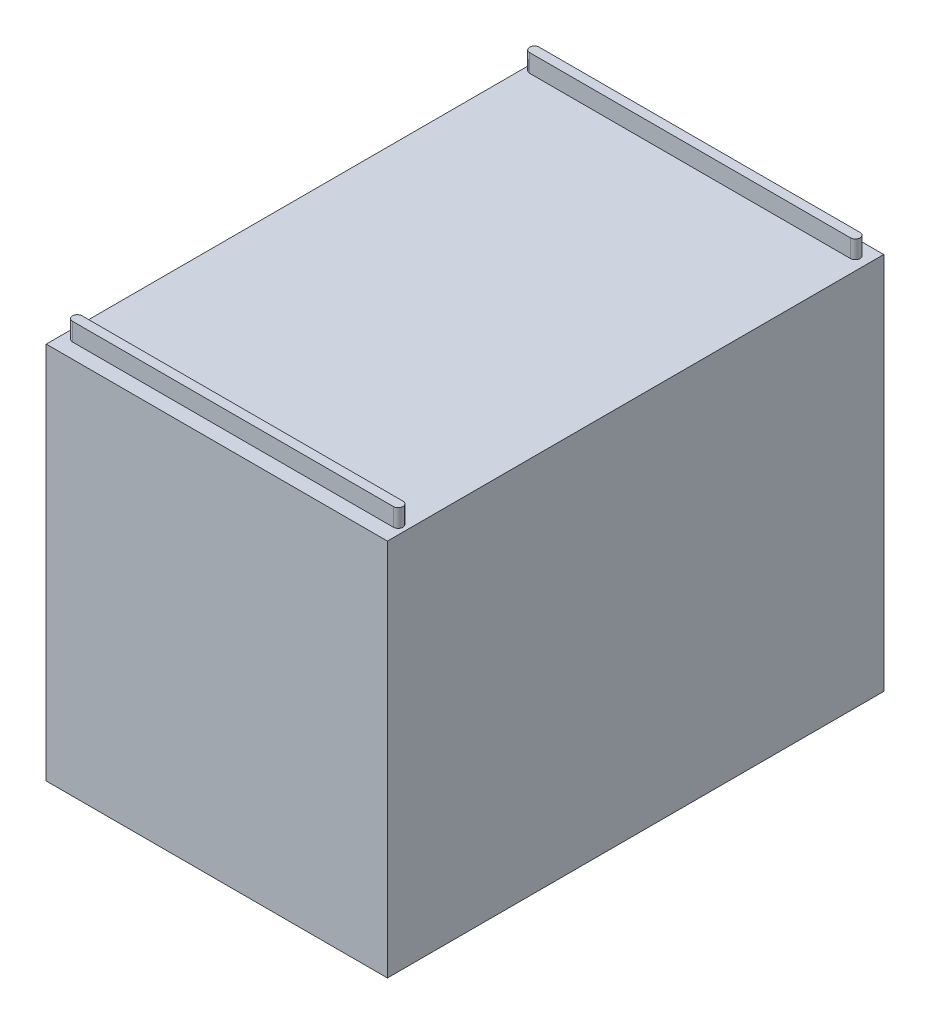
ISO-10303-21;
HEADER;
FILE_DESCRIPTION(('STEP AP214'),'2;1');
FILE_NAME('part.step','',(''),(''),'','','');
FILE_SCHEMA(('AUTOMOTIVE_DESIGN { 1 0 10303 214 1 1 1 1 }'));
ENDSEC;
DATA;
#1=APPLICATION_CONTEXT('core data for automotive mechanical design processes');
#2=APPLICATION_PROTOCOL_DEFINITION('international standard','automotive_design',2000,#1);
#3=PRODUCT_CONTEXT('',#1,'mechanical');
#4=PRODUCT('Part','Part','',(#3));
#5=PRODUCT_RELATED_PRODUCT_CATEGORY('part','',(#4));
#6=PRODUCT_DEFINITION_FORMATION('','',#4);
#7=PRODUCT_DEFINITION_CONTEXT('part definition',#1,'design');
#8=PRODUCT_DEFINITION('design','',#6,#7);
#9=PRODUCT_DEFINITION_SHAPE('','',#8);
#10=(LENGTH_UNIT() NAMED_UNIT(*) SI_UNIT(.MILLI.,.METRE.));
#11=(NAMED_UNIT(*) PLANE_ANGLE_UNIT() SI_UNIT($,.RADIAN.));
#12=(NAMED_UNIT(*) SI_UNIT($,.STERADIAN.) SOLID_ANGLE_UNIT());
#13=UNCERTAINTY_MEASURE_WITH_UNIT(LENGTH_MEASURE(1.E-05),#10,'distance_accuracy_value','');
#14=(GEOMETRIC_REPRESENTATION_CONTEXT(3) GLOBAL_UNCERTAINTY_ASSIGNED_CONTEXT((#13)) GLOBAL_UNIT_ASSIGNED_CONTEXT((#10,
#11,#12)) REPRESENTATION_CONTEXT('',''));
#15=CARTESIAN_POINT('',(0.,0.,0.));
#16=DIRECTION('',(0.,0.,1.));
#17=DIRECTION('',(1.,0.,0.));
#18=AXIS2_PLACEMENT_3D('',#15,#16,#17);
#19=CARTESIAN_POINT('',(2.,51.4955968520772,109.113300223872));
#20=DIRECTION('',(0.,-1.,0.));
#21=DIRECTION('',(0.,0.,-1.));
#22=AXIS2_PLACEMENT_3D('',#19,#20,#21);
#23=PLANE('',#22);
#24=DIRECTION('',(-1.,0.,0.));
#25=VECTOR('',#24,1.);
#26=CARTESIAN_POINT('',(1.88791249608245,51.4955968520772,105.030139818183));
#27=LINE('',#26,#25);
#28=CARTESIAN_POINT('',(55.5032426503019,51.4955968520772,105.030139818183));
#29=VERTEX_POINT('',#28);
#30=CARTESIAN_POINT('',(1.88791249608245,51.4955968520772,105.030139818183));
#31=VERTEX_POINT('',#30);
#32=EDGE_CURVE('E727',#29,#31,#27,.T.);
#33=ORIENTED_EDGE('',*,*,#32,.F.);
#34=CARTESIAN_POINT('',(55.5032426503019,51.4955968520772,105.822875190851));
#35=DIRECTION('',(0.,1.,0.));
#36=DIRECTION('',(0.,0.,1.));
#37=AXIS2_PLACEMENT_3D('',#34,#35,#36);
#38=CIRCLE('',#37,0.792735372668218);
#39=CARTESIAN_POINT('',(55.5032426503019,51.4955968520772,106.615610563519));
#40=VERTEX_POINT('',#39);
#41=EDGE_CURVE('E736',#40,#29,#38,.T.);
#42=ORIENTED_EDGE('',*,*,#41,.F.);
#43=DIRECTION('',(1.,0.,0.));
#44=VECTOR('',#43,1.);
#45=CARTESIAN_POINT('',(1.88791249608245,51.4955968520772,106.615610563519));
#46=LINE('',#45,#44);
#47=CARTESIAN_POINT('',(1.88791249608245,51.4955968520772,106.615610563519));
#48=VERTEX_POINT('',#47);
#49=EDGE_CURVE('E716',#48,#40,#46,.T.);
#50=ORIENTED_EDGE('',*,*,#49,.F.);
#51=CARTESIAN_POINT('',(1.88791249608245,51.4955968520772,105.822875190851));
#52=DIRECTION('',(0.,1.,0.));
#53=DIRECTION('',(0.,0.,1.));
#54=AXIS2_PLACEMENT_3D('',#51,#52,#53);
#55=CIRCLE('',#54,0.792735372668218);
#56=EDGE_CURVE('E712',#31,#48,#55,.T.);
#57=ORIENTED_EDGE('',*,*,#56,.F.);
#58=EDGE_LOOP('',(#33,#42,#50,#57));
#59=FACE_BOUND('',#58,.T.);
#60=DIRECTION('',(0.,0.,1.));
#61=VECTOR('',#60,1.);
#62=CARTESIAN_POINT('',(0.,51.4955968520772,109.113300223872));
#63=LINE('',#62,#61);
#64=CARTESIAN_POINT('',(0.,51.4955968520772,26.1853162216021));
#65=VERTEX_POINT('',#64);
#66=CARTESIAN_POINT('',(0.,51.4955968520772,109.113300223872));
#67=VERTEX_POINT('',#66);
#68=EDGE_CURVE('E270',#65,#67,#63,.T.);
#69=ORIENTED_EDGE('',*,*,#68,.T.);
#70=DIRECTION('',(-1.,0.,0.));
#71=VECTOR('',#70,1.);
#72=CARTESIAN_POINT('',(2.,51.4955968520772,109.113300223872));
#73=LINE('',#72,#71);
#74=CARTESIAN_POINT('',(57.,51.4955968520772,109.113300223872));
#75=VERTEX_POINT('',#74);
#76=EDGE_CURVE('E273',#75,#67,#73,.T.);
#77=ORIENTED_EDGE('',*,*,#76,.F.);
#78=DIRECTION('',(0.,0.,1.));
#79=VECTOR('',#78,1.);
#80=CARTESIAN_POINT('',(57.,51.4955968520772,109.113300223872));
#81=LINE('',#80,#79);
#82=CARTESIAN_POINT('',(57.,51.4955968520772,26.1853162216021));
#83=VERTEX_POINT('',#82);
#84=EDGE_CURVE('E256',#83,#75,#81,.T.);
#85=ORIENTED_EDGE('',*,*,#84,.F.);
#86=DIRECTION('',(-1.,0.,0.));
#87=VECTOR('',#86,1.);
#88=CARTESIAN_POINT('',(2.,51.4955968520772,26.1853162216021));
#89=LINE('',#88,#87);
#90=EDGE_CURVE('E275',#83,#65,#89,.T.);
#91=ORIENTED_EDGE('',*,*,#90,.T.);
#92=EDGE_LOOP('',(#69,#77,#85,#91));
#93=FACE_BOUND('',#92,.T.);
#94=CARTESIAN_POINT('',(1.20636212602488,51.4955968520772,28.7593672566491));
#95=DIRECTION('',(0.,1.,0.));
#96=DIRECTION('',(0.,0.,1.));
#97=AXIS2_PLACEMENT_3D('',#94,#95,#96);
#98=CIRCLE('',#97,0.792735372668218);
#99=CARTESIAN_POINT('',(1.20636212602488,51.4955968520772,27.9666318839809));
#100=VERTEX_POINT('',#99);
#101=CARTESIAN_POINT('',(1.20636212602488,51.4955968520772,29.5521026293173));
#102=VERTEX_POINT('',#101);
#103=EDGE_CURVE('E711',#100,#102,#98,.T.);
#104=ORIENTED_EDGE('',*,*,#103,.F.);
#105=DIRECTION('',(-1.,0.,0.));
#106=VECTOR('',#105,1.);
#107=CARTESIAN_POINT('',(1.20636212602488,51.4955968520772,27.9666318839809));
#108=LINE('',#107,#106);
#109=CARTESIAN_POINT('',(54.8216922802444,51.4955968520772,27.9666318839809));
#110=VERTEX_POINT('',#109);
#111=EDGE_CURVE('E707',#110,#100,#108,.T.);
#112=ORIENTED_EDGE('',*,*,#111,.F.);
#113=CARTESIAN_POINT('',(54.8216922802444,51.4955968520772,28.7593672566491));
#114=DIRECTION('',(0.,1.,0.));
#115=DIRECTION('',(0.,0.,1.));
#116=AXIS2_PLACEMENT_3D('',#113,#114,#115);
#117=CIRCLE('',#116,0.792735372668218);
#118=CARTESIAN_POINT('',(54.8216922802444,51.4955968520772,29.5521026293173));
#119=VERTEX_POINT('',#118);
#120=EDGE_CURVE('E858',#119,#110,#117,.T.);
#121=ORIENTED_EDGE('',*,*,#120,.F.);
#122=DIRECTION('',(1.,0.,0.));
#123=VECTOR('',#122,1.);
#124=CARTESIAN_POINT('',(1.20636212602488,51.4955968520772,29.5521026293173));
#125=LINE('',#124,#123);
#126=EDGE_CURVE('E56',#102,#119,#125,.T.);
#127=ORIENTED_EDGE('',*,*,#126,.F.);
#128=EDGE_LOOP('',(#104,#112,#121,#127));
#129=FACE_BOUND('',#128,.T.);
#130=ADVANCED_FACE('F34',(#59,#93,#129),#23,.F.);
#131=CARTESIAN_POINT('',(2.,0.,0.));
#132=DIRECTION('',(1.,0.,0.));
#133=DIRECTION('',(0.,0.,-1.));
#134=AXIS2_PLACEMENT_3D('',#131,#132,#133);
#135=PLANE('',#134);
#136=DIRECTION('',(0.,-1.,0.));
#137=VECTOR('',#136,1.);
#138=CARTESIAN_POINT('',(2.,0.,98.15899887559));
#139=LINE('',#138,#137);
#140=CARTESIAN_POINT('',(2.,30.0428200792169,98.15899887559));
#141=VERTEX_POINT('',#140);
#142=CARTESIAN_POINT('',(2.,-0.559273207727524,98.15899887559));
#143=VERTEX_POINT('',#142);
#144=EDGE_CURVE('E840',#141,#143,#139,.T.);
#145=ORIENTED_EDGE('',*,*,#144,.F.);
#146=DIRECTION('',(0.,0.,1.));
#147=VECTOR('',#146,1.);
#148=CARTESIAN_POINT('',(2.,30.0428200792169,0.));
#149=LINE('',#148,#147);
#150=CARTESIAN_POINT('',(2.,30.0428200792169,56.6585640793278));
#151=VERTEX_POINT('',#150);
#152=EDGE_CURVE('E827',#151,#141,#149,.T.);
#153=ORIENTED_EDGE('',*,*,#152,.F.);
#154=DIRECTION('',(0.,1.,0.));
#155=VECTOR('',#154,1.);
#156=CARTESIAN_POINT('',(2.,0.,56.6585640793278));
#157=LINE('',#156,#155);
#158=CARTESIAN_POINT('',(2.,-0.559273207727524,56.6585640793278));
#159=VERTEX_POINT('',#158);
#160=EDGE_CURVE('E835',#159,#151,#157,.T.);
#161=ORIENTED_EDGE('',*,*,#160,.F.);
#162=DIRECTION('',(0.,0.,-1.));
#163=VECTOR('',#162,1.);
#164=CARTESIAN_POINT('',(2.,-0.559273207727524,0.));
#165=LINE('',#164,#163);
#166=EDGE_CURVE('E838',#143,#159,#165,.T.);
#167=ORIENTED_EDGE('',*,*,#166,.F.);
#168=EDGE_LOOP('',(#145,#153,#161,#167));
#169=FACE_BOUND('',#168,.T.);
#170=DIRECTION('',(0.,0.,1.));
#171=VECTOR('',#170,1.);
#172=CARTESIAN_POINT('',(2.,-7.75802853354126,109.113300223872));
#173=LINE('',#172,#171);
#174=CARTESIAN_POINT('',(2.,-7.75802853354126,30.1211238131174));
#175=VERTEX_POINT('',#174);
#176=CARTESIAN_POINT('',(2.,-7.75802853354126,104.891427523128));
#177=VERTEX_POINT('',#176);
#178=EDGE_CURVE('E245',#175,#177,#173,.T.);
#179=ORIENTED_EDGE('',*,*,#178,.F.);
#180=DIRECTION('',(0.,1.,0.));
#181=VECTOR('',#180,1.);
#182=CARTESIAN_POINT('',(2.,-10.9702115813971,30.1211238131174));
#183=LINE('',#182,#181);
#184=CARTESIAN_POINT('',(2.,48.0297884186029,30.1211238131174));
#185=VERTEX_POINT('',#184);
#186=EDGE_CURVE('E233',#175,#185,#183,.T.);
#187=ORIENTED_EDGE('',*,*,#186,.T.);
#188=DIRECTION('',(0.,0.,-1.));
#189=VECTOR('',#188,1.);
#190=CARTESIAN_POINT('',(2.,48.0297884186029,109.113300223872));
#191=LINE('',#190,#189);
#192=CARTESIAN_POINT('',(2.,48.0297884186029,104.891427523128));
#193=VERTEX_POINT('',#192);
#194=EDGE_CURVE('E249',#193,#185,#191,.T.);
#195=ORIENTED_EDGE('',*,*,#194,.F.);
#196=DIRECTION('',(0.,1.,0.));
#197=VECTOR('',#196,1.);
#198=CARTESIAN_POINT('',(2.,48.0297884186029,104.891427523128));
#199=LINE('',#198,#197);
#200=EDGE_CURVE('E234',#177,#193,#199,.T.);
#201=ORIENTED_EDGE('',*,*,#200,.F.);
#202=EDGE_LOOP('',(#179,#187,#195,#201));
#203=FACE_BOUND('',#202,.T.);
#204=DIRECTION('',(0.,0.,1.));
#205=VECTOR('',#204,1.);
#206=CARTESIAN_POINT('',(2.,14.1758803163095,36.8475382860855));
#207=LINE('',#206,#205);
#208=CARTESIAN_POINT('',(2.,14.1758803163095,36.8475382860855));
#209=VERTEX_POINT('',#208);
#210=CARTESIAN_POINT('',(2.,14.1758803163095,47.313522717548));
#211=VERTEX_POINT('',#210);
#212=EDGE_CURVE('E765',#209,#211,#207,.T.);
#213=ORIENTED_EDGE('',*,*,#212,.F.);
#214=DIRECTION('',(0.,1.,0.));
#215=VECTOR('',#214,1.);
#216=CARTESIAN_POINT('',(2.,0.,36.8475382860855));
#217=LINE('',#216,#215);
#218=CARTESIAN_POINT('',(2.,0.,36.8475382860855));
#219=VERTEX_POINT('',#218);
#220=EDGE_CURVE('E751',#219,#209,#217,.T.);
#221=ORIENTED_EDGE('',*,*,#220,.F.);
#222=DIRECTION('',(0.,0.,-1.));
#223=VECTOR('',#222,1.);
#224=CARTESIAN_POINT('',(2.,0.,36.8475382860855));
#225=LINE('',#224,#223);
#226=CARTESIAN_POINT('',(2.,0.,47.313522717548));
#227=VERTEX_POINT('',#226);
#228=EDGE_CURVE('E756',#227,#219,#225,.T.);
#229=ORIENTED_EDGE('',*,*,#228,.F.);
#230=DIRECTION('',(0.,-1.,0.));
#231=VECTOR('',#230,1.);
#232=CARTESIAN_POINT('',(2.,0.,47.313522717548));
#233=LINE('',#232,#231);
#234=EDGE_CURVE('E767',#211,#227,#233,.T.);
#235=ORIENTED_EDGE('',*,*,#234,.F.);
#236=EDGE_LOOP('',(#213,#221,#229,#235));
#237=FACE_BOUND('',#236,.T.);
#238=ADVANCED_FACE('F311',(#169,#203,#237),#135,.T.);
#239=CARTESIAN_POINT('',(57.,48.0297884186029,109.113300223872));
#240=DIRECTION('',(0.,1.,0.));
#241=DIRECTION('',(0.,0.,1.));
#242=AXIS2_PLACEMENT_3D('',#239,#240,#241);
#243=PLANE('',#242);
#244=DIRECTION('',(-1.,0.,0.));
#245=VECTOR('',#244,1.);
#246=CARTESIAN_POINT('',(57.,48.0297884186029,30.1211238131174));
#247=LINE('',#246,#245);
#248=CARTESIAN_POINT('',(56.,48.0297884186029,30.1211238131174));
#249=VERTEX_POINT('',#248);
#250=EDGE_CURVE('E239',#249,#185,#247,.T.);
#251=ORIENTED_EDGE('',*,*,#250,.F.);
#252=DIRECTION('',(0.,0.,1.));
#253=VECTOR('',#252,1.);
#254=CARTESIAN_POINT('',(56.,48.0297884186029,109.113300223872));
#255=LINE('',#254,#253);
#256=CARTESIAN_POINT('',(56.,48.0297884186029,104.891427523128));
#257=VERTEX_POINT('',#256);
#258=EDGE_CURVE('E49',#249,#257,#255,.T.);
#259=ORIENTED_EDGE('',*,*,#258,.T.);
#260=DIRECTION('',(-1.,0.,0.));
#261=VECTOR('',#260,1.);
#262=CARTESIAN_POINT('',(57.,48.0297884186029,104.891427523128));
#263=LINE('',#262,#261);
#264=EDGE_CURVE('E237',#257,#193,#263,.T.);
#265=ORIENTED_EDGE('',*,*,#264,.T.);
#266=ORIENTED_EDGE('',*,*,#194,.T.);
#267=EDGE_LOOP('',(#251,#259,#265,#266));
#268=FACE_BOUND('',#267,.T.);
#269=DIRECTION('',(0.,0.,-1.));
#270=VECTOR('',#269,1.);
#271=CARTESIAN_POINT('',(7.09762250892254,48.0297884186029,36.816501956509));
#272=LINE('',#271,#270);
#273=CARTESIAN_POINT('',(7.09762250892254,48.0297884186029,103.513398298831));
#274=VERTEX_POINT('',#273);
#275=CARTESIAN_POINT('',(7.09762250892254,48.0297884186029,36.816501956509));
#276=VERTEX_POINT('',#275);
#277=EDGE_CURVE('E780',#274,#276,#272,.T.);
#278=ORIENTED_EDGE('',*,*,#277,.F.);
#279=DIRECTION('',(-1.,0.,0.));
#280=VECTOR('',#279,1.);
#281=CARTESIAN_POINT('',(7.09762250892254,48.0297884186029,103.513398298831));
#282=LINE('',#281,#280);
#283=CARTESIAN_POINT('',(51.6742877071579,48.0297884186029,103.513398298831));
#284=VERTEX_POINT('',#283);
#285=EDGE_CURVE('E785',#284,#274,#282,.T.);
#286=ORIENTED_EDGE('',*,*,#285,.F.);
#287=DIRECTION('',(0.,0.,1.));
#288=VECTOR('',#287,1.);
#289=CARTESIAN_POINT('',(51.6742877071579,48.0297884186029,36.816501956509));
#290=LINE('',#289,#288);
#291=CARTESIAN_POINT('',(51.6742877071579,48.0297884186029,36.816501956509));
#292=VERTEX_POINT('',#291);
#293=EDGE_CURVE('E797',#292,#284,#290,.T.);
#294=ORIENTED_EDGE('',*,*,#293,.F.);
#295=DIRECTION('',(1.,0.,0.));
#296=VECTOR('',#295,1.);
#297=CARTESIAN_POINT('',(7.09762250892254,48.0297884186029,36.816501956509));
#298=LINE('',#297,#296);
#299=EDGE_CURVE('E794',#276,#292,#298,.T.);
#300=ORIENTED_EDGE('',*,*,#299,.F.);
#301=EDGE_LOOP('',(#278,#286,#294,#300));
#302=FACE_BOUND('',#301,.T.);
#303=ADVANCED_FACE('F317',(#268,#302),#243,.F.);
#304=CARTESIAN_POINT('',(57.,-7.75802853354126,109.113300223872));
#305=DIRECTION('',(0.,-1.,0.));
#306=DIRECTION('',(0.,0.,-1.));
#307=AXIS2_PLACEMENT_3D('',#304,#305,#306);
#308=PLANE('',#307);
#309=DIRECTION('',(-1.,0.,0.));
#310=VECTOR('',#309,1.);
#311=CARTESIAN_POINT('',(57.,-7.75802853354126,104.891427523128));
#312=LINE('',#311,#310);
#313=CARTESIAN_POINT('',(56.,-7.75802853354126,104.891427523128));
#314=VERTEX_POINT('',#313);
#315=EDGE_CURVE('E229',#314,#177,#312,.T.);
#316=ORIENTED_EDGE('',*,*,#315,.F.);
#317=DIRECTION('',(0.,0.,-1.));
#318=VECTOR('',#317,1.);
#319=CARTESIAN_POINT('',(56.,-7.75802853354126,109.113300223872));
#320=LINE('',#319,#318);
#321=CARTESIAN_POINT('',(56.,-7.75802853354126,30.1211238131174));
#322=VERTEX_POINT('',#321);
#323=EDGE_CURVE('E217',#314,#322,#320,.T.);
#324=ORIENTED_EDGE('',*,*,#323,.T.);
#325=DIRECTION('',(1.,0.,0.));
#326=VECTOR('',#325,1.);
#327=CARTESIAN_POINT('',(57.,-7.75802853354126,30.1211238131174));
#328=LINE('',#327,#326);
#329=EDGE_CURVE('E227',#175,#322,#328,.T.);
#330=ORIENTED_EDGE('',*,*,#329,.F.);
#331=ORIENTED_EDGE('',*,*,#178,.T.);
#332=EDGE_LOOP('',(#316,#324,#330,#331));
#333=FACE_BOUND('',#332,.T.);
#334=ADVANCED_FACE('F225',(#333),#308,.F.);
#335=CARTESIAN_POINT('',(2.,51.4955968520772,109.113300223872));
#336=DIRECTION('',(0.,0.,-1.));
#337=DIRECTION('',(-1.,0.,0.));
#338=AXIS2_PLACEMENT_3D('',#335,#336,#337);
#339=PLANE('',#338);
#340=DIRECTION('',(0.,-1.,0.));
#341=VECTOR('',#340,1.);
#342=CARTESIAN_POINT('',(0.,51.4955968520772,109.113300223872));
#343=LINE('',#342,#341);
#344=CARTESIAN_POINT('',(0.,-11.7253418052314,109.113300223872));
#345=VERTEX_POINT('',#344);
#346=EDGE_CURVE('E259',#67,#345,#343,.T.);
#347=ORIENTED_EDGE('',*,*,#346,.T.);
#348=DIRECTION('',(-1.,0.,0.));
#349=VECTOR('',#348,1.);
#350=CARTESIAN_POINT('',(2.,-11.7253418052314,109.113300223872));
#351=LINE('',#350,#349);
#352=CARTESIAN_POINT('',(57.,-11.7253418052314,109.113300223872));
#353=VERTEX_POINT('',#352);
#354=EDGE_CURVE('E42',#353,#345,#351,.T.);
#355=ORIENTED_EDGE('',*,*,#354,.F.);
#356=DIRECTION('',(0.,-1.,0.));
#357=VECTOR('',#356,1.);
#358=CARTESIAN_POINT('',(57.,51.4955968520772,109.113300223872));
#359=LINE('',#358,#357);
#360=EDGE_CURVE('E251',#75,#353,#359,.T.);
#361=ORIENTED_EDGE('',*,*,#360,.F.);
#362=ORIENTED_EDGE('',*,*,#76,.T.);
#363=EDGE_LOOP('',(#347,#355,#361,#362));
#364=FACE_BOUND('',#363,.T.);
#365=ADVANCED_FACE('F36',(#364),#339,.F.);
#366=CARTESIAN_POINT('',(2.,-11.7253418052314,109.113300223872));
#367=DIRECTION('',(0.,1.,0.));
#368=DIRECTION('',(0.,0.,1.));
#369=AXIS2_PLACEMENT_3D('',#366,#367,#368);
#370=PLANE('',#369);
#371=DIRECTION('',(0.,0.,-1.));
#372=VECTOR('',#371,1.);
#373=CARTESIAN_POINT('',(0.,-11.7253418052314,109.113300223872));
#374=LINE('',#373,#372);
#375=CARTESIAN_POINT('',(0.,-11.7253418052314,26.1853162216021));
#376=VERTEX_POINT('',#375);
#377=EDGE_CURVE('E264',#345,#376,#374,.T.);
#378=ORIENTED_EDGE('',*,*,#377,.T.);
#379=DIRECTION('',(-1.,0.,0.));
#380=VECTOR('',#379,1.);
#381=CARTESIAN_POINT('',(2.,-11.7253418052314,26.1853162216021));
#382=LINE('',#381,#380);
#383=CARTESIAN_POINT('',(57.,-11.7253418052314,26.1853162216021));
#384=VERTEX_POINT('',#383);
#385=EDGE_CURVE('E277',#384,#376,#382,.T.);
#386=ORIENTED_EDGE('',*,*,#385,.F.);
#387=DIRECTION('',(0.,0.,-1.));
#388=VECTOR('',#387,1.);
#389=CARTESIAN_POINT('',(57.,-11.7253418052314,109.113300223872));
#390=LINE('',#389,#388);
#391=EDGE_CURVE('E246',#353,#384,#390,.T.);
#392=ORIENTED_EDGE('',*,*,#391,.F.);
#393=ORIENTED_EDGE('',*,*,#354,.T.);
#394=EDGE_LOOP('',(#378,#386,#392,#393));
#395=FACE_BOUND('',#394,.T.);
#396=ADVANCED_FACE('F282',(#395),#370,.F.);
#397=CARTESIAN_POINT('',(2.,51.4955968520772,26.1853162216021));
#398=DIRECTION('',(0.,0.,1.));
#399=DIRECTION('',(1.,0.,0.));
#400=AXIS2_PLACEMENT_3D('',#397,#398,#399);
#401=PLANE('',#400);
#402=DIRECTION('',(0.,1.,0.));
#403=VECTOR('',#402,1.);
#404=CARTESIAN_POINT('',(0.,51.4955968520772,26.1853162216021));
#405=LINE('',#404,#403);
#406=EDGE_CURVE('E267',#376,#65,#405,.T.);
#407=ORIENTED_EDGE('',*,*,#406,.T.);
#408=ORIENTED_EDGE('',*,*,#90,.F.);
#409=DIRECTION('',(0.,1.,0.));
#410=VECTOR('',#409,1.);
#411=CARTESIAN_POINT('',(57.,51.4955968520772,26.1853162216021));
#412=LINE('',#411,#410);
#413=EDGE_CURVE('E253',#384,#83,#412,.T.);
#414=ORIENTED_EDGE('',*,*,#413,.F.);
#415=ORIENTED_EDGE('',*,*,#385,.T.);
#416=EDGE_LOOP('',(#407,#408,#414,#415));
#417=FACE_BOUND('',#416,.T.);
#418=ADVANCED_FACE('F294',(#417),#401,.F.);
#419=CARTESIAN_POINT('',(0.,0.,0.));
#420=DIRECTION('',(1.,0.,0.));
#421=DIRECTION('',(0.,0.,-1.));
#422=AXIS2_PLACEMENT_3D('',#419,#420,#421);
#423=PLANE('',#422);
#424=DIRECTION('',(0.,0.,-1.));
#425=VECTOR('',#424,1.);
#426=CARTESIAN_POINT('',(0.,30.0428200792169,98.15899887559));
#427=LINE('',#426,#425);
#428=CARTESIAN_POINT('',(0.,30.0428200792169,98.15899887559));
#429=VERTEX_POINT('',#428);
#430=CARTESIAN_POINT('',(0.,30.0428200792169,56.6585640793278));
#431=VERTEX_POINT('',#430);
#432=EDGE_CURVE('E815',#429,#431,#427,.T.);
#433=ORIENTED_EDGE('',*,*,#432,.F.);
#434=DIRECTION('',(0.,1.,0.));
#435=VECTOR('',#434,1.);
#436=CARTESIAN_POINT('',(0.,-0.559273207727524,98.15899887559));
#437=LINE('',#436,#435);
#438=CARTESIAN_POINT('',(0.,-0.559273207727524,98.15899887559));
#439=VERTEX_POINT('',#438);
#440=EDGE_CURVE('E813',#439,#429,#437,.T.);
#441=ORIENTED_EDGE('',*,*,#440,.F.);
#442=DIRECTION('',(0.,0.,1.));
#443=VECTOR('',#442,1.);
#444=CARTESIAN_POINT('',(0.,-0.559273207727524,98.15899887559));
#445=LINE('',#444,#443);
#446=CARTESIAN_POINT('',(0.,-0.559273207727524,56.6585640793278));
#447=VERTEX_POINT('',#446);
#448=EDGE_CURVE('E821',#447,#439,#445,.T.);
#449=ORIENTED_EDGE('',*,*,#448,.F.);
#450=DIRECTION('',(0.,-1.,0.));
#451=VECTOR('',#450,1.);
#452=CARTESIAN_POINT('',(0.,-0.559273207727524,56.6585640793278));
#453=LINE('',#452,#451);
#454=EDGE_CURVE('E818',#431,#447,#453,.T.);
#455=ORIENTED_EDGE('',*,*,#454,.F.);
#456=EDGE_LOOP('',(#433,#441,#449,#455));
#457=FACE_BOUND('',#456,.T.);
#458=ORIENTED_EDGE('',*,*,#346,.F.);
#459=ORIENTED_EDGE('',*,*,#68,.F.);
#460=ORIENTED_EDGE('',*,*,#406,.F.);
#461=ORIENTED_EDGE('',*,*,#377,.F.);
#462=EDGE_LOOP('',(#458,#459,#460,#461));
#463=FACE_BOUND('',#462,.T.);
#464=ADVANCED_FACE('F289',(#457,#463),#423,.F.);
#465=CARTESIAN_POINT('',(57.,0.,0.));
#466=DIRECTION('',(1.,0.,0.));
#467=DIRECTION('',(0.,0.,-1.));
#468=AXIS2_PLACEMENT_3D('',#465,#466,#467);
#469=PLANE('',#468);
#470=ORIENTED_EDGE('',*,*,#391,.T.);
#471=ORIENTED_EDGE('',*,*,#413,.T.);
#472=ORIENTED_EDGE('',*,*,#84,.T.);
#473=ORIENTED_EDGE('',*,*,#360,.T.);
#474=EDGE_LOOP('',(#470,#471,#472,#473));
#475=FACE_BOUND('',#474,.T.);
#476=ADVANCED_FACE('F296',(#475),#469,.T.);
#477=CARTESIAN_POINT('',(57.,48.0297884186029,104.891427523128));
#478=DIRECTION('',(0.,0.,1.));
#479=DIRECTION('',(1.,0.,0.));
#480=AXIS2_PLACEMENT_3D('',#477,#478,#479);
#481=PLANE('',#480);
#482=ORIENTED_EDGE('',*,*,#264,.F.);
#483=DIRECTION('',(0.,-1.,0.));
#484=VECTOR('',#483,1.);
#485=CARTESIAN_POINT('',(56.,48.0297884186029,104.891427523128));
#486=LINE('',#485,#484);
#487=EDGE_CURVE('E847',#257,#314,#486,.T.);
#488=ORIENTED_EDGE('',*,*,#487,.T.);
#489=ORIENTED_EDGE('',*,*,#315,.T.);
#490=ORIENTED_EDGE('',*,*,#200,.T.);
#491=EDGE_LOOP('',(#482,#488,#489,#490));
#492=FACE_BOUND('',#491,.T.);
#493=ADVANCED_FACE('F298',(#492),#481,.F.);
#494=CARTESIAN_POINT('',(57.,-10.9702115813971,30.1211238131174));
#495=DIRECTION('',(0.,0.,-1.));
#496=DIRECTION('',(-1.,0.,0.));
#497=AXIS2_PLACEMENT_3D('',#494,#495,#496);
#498=PLANE('',#497);
#499=ORIENTED_EDGE('',*,*,#329,.T.);
#500=DIRECTION('',(0.,1.,0.));
#501=VECTOR('',#500,1.);
#502=CARTESIAN_POINT('',(56.,-10.9702115813971,30.1211238131174));
#503=LINE('',#502,#501);
#504=EDGE_CURVE('E11',#322,#249,#503,.T.);
#505=ORIENTED_EDGE('',*,*,#504,.T.);
#506=ORIENTED_EDGE('',*,*,#250,.T.);
#507=ORIENTED_EDGE('',*,*,#186,.F.);
#508=EDGE_LOOP('',(#499,#505,#506,#507));
#509=FACE_BOUND('',#508,.T.);
#510=ADVANCED_FACE('F231',(#509),#498,.F.);
#511=CARTESIAN_POINT('',(59.,-0.559273207727524,98.15899887559));
#512=DIRECTION('',(0.,0.,1.));
#513=DIRECTION('',(1.,0.,0.));
#514=AXIS2_PLACEMENT_3D('',#511,#512,#513);
#515=PLANE('',#514);
#516=ORIENTED_EDGE('',*,*,#144,.T.);
#517=DIRECTION('',(-1.,0.,0.));
#518=VECTOR('',#517,1.);
#519=CARTESIAN_POINT('',(59.,-0.559273207727524,98.15899887559));
#520=LINE('',#519,#518);
#521=EDGE_CURVE('E825',#143,#439,#520,.T.);
#522=ORIENTED_EDGE('',*,*,#521,.T.);
#523=ORIENTED_EDGE('',*,*,#440,.T.);
#524=DIRECTION('',(-1.,0.,0.));
#525=VECTOR('',#524,1.);
#526=CARTESIAN_POINT('',(59.,30.0428200792169,98.15899887559));
#527=LINE('',#526,#525);
#528=EDGE_CURVE('E824',#141,#429,#527,.T.);
#529=ORIENTED_EDGE('',*,*,#528,.F.);
#530=EDGE_LOOP('',(#516,#522,#523,#529));
#531=FACE_BOUND('',#530,.T.);
#532=ADVANCED_FACE('F337',(#531),#515,.F.);
#533=CARTESIAN_POINT('',(59.,-0.559273207727524,98.15899887559));
#534=DIRECTION('',(0.,-1.,0.));
#535=DIRECTION('',(0.,0.,-1.));
#536=AXIS2_PLACEMENT_3D('',#533,#534,#535);
#537=PLANE('',#536);
#538=ORIENTED_EDGE('',*,*,#166,.T.);
#539=DIRECTION('',(-1.,0.,0.));
#540=VECTOR('',#539,1.);
#541=CARTESIAN_POINT('',(59.,-0.559273207727524,56.6585640793278));
#542=LINE('',#541,#540);
#543=EDGE_CURVE('E828',#159,#447,#542,.T.);
#544=ORIENTED_EDGE('',*,*,#543,.T.);
#545=ORIENTED_EDGE('',*,*,#448,.T.);
#546=ORIENTED_EDGE('',*,*,#521,.F.);
#547=EDGE_LOOP('',(#538,#544,#545,#546));
#548=FACE_BOUND('',#547,.T.);
#549=ADVANCED_FACE('F340',(#548),#537,.F.);
#550=CARTESIAN_POINT('',(59.,-0.559273207727524,56.6585640793278));
#551=DIRECTION('',(0.,0.,-1.));
#552=DIRECTION('',(-1.,0.,0.));
#553=AXIS2_PLACEMENT_3D('',#550,#551,#552);
#554=PLANE('',#553);
#555=ORIENTED_EDGE('',*,*,#160,.T.);
#556=DIRECTION('',(-1.,0.,0.));
#557=VECTOR('',#556,1.);
#558=CARTESIAN_POINT('',(59.,30.0428200792169,56.6585640793278));
#559=LINE('',#558,#557);
#560=EDGE_CURVE('E830',#151,#431,#559,.T.);
#561=ORIENTED_EDGE('',*,*,#560,.T.);
#562=ORIENTED_EDGE('',*,*,#454,.T.);
#563=ORIENTED_EDGE('',*,*,#543,.F.);
#564=EDGE_LOOP('',(#555,#561,#562,#563));
#565=FACE_BOUND('',#564,.T.);
#566=ADVANCED_FACE('F346',(#565),#554,.F.);
#567=CARTESIAN_POINT('',(59.,30.0428200792169,98.15899887559));
#568=DIRECTION('',(0.,1.,0.));
#569=DIRECTION('',(0.,0.,1.));
#570=AXIS2_PLACEMENT_3D('',#567,#568,#569);
#571=PLANE('',#570);
#572=ORIENTED_EDGE('',*,*,#152,.T.);
#573=ORIENTED_EDGE('',*,*,#528,.T.);
#574=ORIENTED_EDGE('',*,*,#432,.T.);
#575=ORIENTED_EDGE('',*,*,#560,.F.);
#576=EDGE_LOOP('',(#572,#573,#574,#575));
#577=FACE_BOUND('',#576,.T.);
#578=ADVANCED_FACE('F342',(#577),#571,.F.);
#579=CARTESIAN_POINT('',(7.09762250892254,47.0262783986221,36.816501956509));
#580=DIRECTION('',(1.,0.,0.));
#581=DIRECTION('',(0.,0.,-1.));
#582=AXIS2_PLACEMENT_3D('',#579,#580,#581);
#583=PLANE('',#582);
#584=ORIENTED_EDGE('',*,*,#277,.T.);
#585=DIRECTION('',(0.,1.,0.));
#586=VECTOR('',#585,1.);
#587=CARTESIAN_POINT('',(7.09762250892254,47.0262783986221,36.816501956509));
#588=LINE('',#587,#586);
#589=CARTESIAN_POINT('',(7.09762250892254,47.0262783986221,36.816501956509));
#590=VERTEX_POINT('',#589);
#591=EDGE_CURVE('E810',#590,#276,#588,.T.);
#592=ORIENTED_EDGE('',*,*,#591,.F.);
#593=DIRECTION('',(0.,0.,-1.));
#594=VECTOR('',#593,1.);
#595=CARTESIAN_POINT('',(7.09762250892254,47.0262783986221,36.816501956509));
#596=LINE('',#595,#594);
#597=CARTESIAN_POINT('',(7.09762250892254,47.0262783986221,103.513398298831));
#598=VERTEX_POINT('',#597);
#599=EDGE_CURVE('E781',#598,#590,#596,.T.);
#600=ORIENTED_EDGE('',*,*,#599,.F.);
#601=DIRECTION('',(0.,1.,0.));
#602=VECTOR('',#601,1.);
#603=CARTESIAN_POINT('',(7.09762250892254,47.0262783986221,103.513398298831));
#604=LINE('',#603,#602);
#605=EDGE_CURVE('E791',#598,#274,#604,.T.);
#606=ORIENTED_EDGE('',*,*,#605,.T.);
#607=EDGE_LOOP('',(#584,#592,#600,#606));
#608=FACE_BOUND('',#607,.T.);
#609=ADVANCED_FACE('F345',(#608),#583,.F.);
#610=CARTESIAN_POINT('',(7.09762250892254,47.0262783986221,36.816501956509));
#611=DIRECTION('',(0.,0.,1.));
#612=DIRECTION('',(1.,0.,0.));
#613=AXIS2_PLACEMENT_3D('',#610,#611,#612);
#614=PLANE('',#613);
#615=ORIENTED_EDGE('',*,*,#299,.T.);
#616=DIRECTION('',(0.,1.,0.));
#617=VECTOR('',#616,1.);
#618=CARTESIAN_POINT('',(51.6742877071579,47.0262783986221,36.816501956509));
#619=LINE('',#618,#617);
#620=CARTESIAN_POINT('',(51.6742877071579,47.0262783986221,36.816501956509));
#621=VERTEX_POINT('',#620);
#622=EDGE_CURVE('E807',#621,#292,#619,.T.);
#623=ORIENTED_EDGE('',*,*,#622,.F.);
#624=DIRECTION('',(1.,0.,0.));
#625=VECTOR('',#624,1.);
#626=CARTESIAN_POINT('',(7.09762250892254,47.0262783986221,36.816501956509));
#627=LINE('',#626,#625);
#628=EDGE_CURVE('E784',#590,#621,#627,.T.);
#629=ORIENTED_EDGE('',*,*,#628,.F.);
#630=ORIENTED_EDGE('',*,*,#591,.T.);
#631=EDGE_LOOP('',(#615,#623,#629,#630));
#632=FACE_BOUND('',#631,.T.);
#633=ADVANCED_FACE('F356',(#632),#614,.F.);
#634=CARTESIAN_POINT('',(51.6742877071579,47.0262783986221,36.816501956509));
#635=DIRECTION('',(-1.,0.,0.));
#636=DIRECTION('',(0.,0.,1.));
#637=AXIS2_PLACEMENT_3D('',#634,#635,#636);
#638=PLANE('',#637);
#639=ORIENTED_EDGE('',*,*,#293,.T.);
#640=DIRECTION('',(0.,1.,0.));
#641=VECTOR('',#640,1.);
#642=CARTESIAN_POINT('',(51.6742877071579,47.0262783986221,103.513398298831));
#643=LINE('',#642,#641);
#644=CARTESIAN_POINT('',(51.6742877071579,47.0262783986221,103.513398298831));
#645=VERTEX_POINT('',#644);
#646=EDGE_CURVE('E804',#645,#284,#643,.T.);
#647=ORIENTED_EDGE('',*,*,#646,.F.);
#648=DIRECTION('',(0.,0.,1.));
#649=VECTOR('',#648,1.);
#650=CARTESIAN_POINT('',(51.6742877071579,47.0262783986221,36.816501956509));
#651=LINE('',#650,#649);
#652=EDGE_CURVE('E787',#621,#645,#651,.T.);
#653=ORIENTED_EDGE('',*,*,#652,.F.);
#654=ORIENTED_EDGE('',*,*,#622,.T.);
#655=EDGE_LOOP('',(#639,#647,#653,#654));
#656=FACE_BOUND('',#655,.T.);
#657=ADVANCED_FACE('F360',(#656),#638,.F.);
#658=CARTESIAN_POINT('',(7.09762250892254,47.0262783986221,103.513398298831));
#659=DIRECTION('',(0.,0.,-1.));
#660=DIRECTION('',(-1.,0.,0.));
#661=AXIS2_PLACEMENT_3D('',#658,#659,#660);
#662=PLANE('',#661);
#663=ORIENTED_EDGE('',*,*,#285,.T.);
#664=ORIENTED_EDGE('',*,*,#605,.F.);
#665=DIRECTION('',(-1.,0.,0.));
#666=VECTOR('',#665,1.);
#667=CARTESIAN_POINT('',(7.09762250892254,47.0262783986221,103.513398298831));
#668=LINE('',#667,#666);
#669=EDGE_CURVE('E789',#645,#598,#668,.T.);
#670=ORIENTED_EDGE('',*,*,#669,.F.);
#671=ORIENTED_EDGE('',*,*,#646,.T.);
#672=EDGE_LOOP('',(#663,#664,#670,#671));
#673=FACE_BOUND('',#672,.T.);
#674=ADVANCED_FACE('F364',(#673),#662,.F.);
#675=CARTESIAN_POINT('',(0.,47.0262783986221,0.));
#676=DIRECTION('',(0.,1.,0.));
#677=DIRECTION('',(0.,0.,1.));
#678=AXIS2_PLACEMENT_3D('',#675,#676,#677);
#679=PLANE('',#678);
#680=ORIENTED_EDGE('',*,*,#599,.T.);
#681=ORIENTED_EDGE('',*,*,#628,.T.);
#682=ORIENTED_EDGE('',*,*,#652,.T.);
#683=ORIENTED_EDGE('',*,*,#669,.T.);
#684=EDGE_LOOP('',(#680,#681,#682,#683));
#685=FACE_BOUND('',#684,.T.);
#686=ADVANCED_FACE('F368',(#685),#679,.F.);
#687=CARTESIAN_POINT('',(4.56149972504697,0.,36.8475382860855));
#688=DIRECTION('',(0.,0.,1.));
#689=DIRECTION('',(1.,0.,0.));
#690=AXIS2_PLACEMENT_3D('',#687,#688,#689);
#691=PLANE('',#690);
#692=ORIENTED_EDGE('',*,*,#220,.T.);
#693=DIRECTION('',(-1.,0.,0.));
#694=VECTOR('',#693,1.);
#695=CARTESIAN_POINT('',(4.56149972504697,14.1758803163095,36.8475382860855));
#696=LINE('',#695,#694);
#697=CARTESIAN_POINT('',(4.56149972504697,14.1758803163095,36.8475382860855));
#698=VERTEX_POINT('',#697);
#699=EDGE_CURVE('E778',#698,#209,#696,.T.);
#700=ORIENTED_EDGE('',*,*,#699,.F.);
#701=DIRECTION('',(0.,1.,0.));
#702=VECTOR('',#701,1.);
#703=CARTESIAN_POINT('',(4.56149972504697,0.,36.8475382860855));
#704=LINE('',#703,#702);
#705=CARTESIAN_POINT('',(4.56149972504697,0.,36.8475382860855));
#706=VERTEX_POINT('',#705);
#707=EDGE_CURVE('E752',#706,#698,#704,.T.);
#708=ORIENTED_EDGE('',*,*,#707,.F.);
#709=DIRECTION('',(-1.,0.,0.));
#710=VECTOR('',#709,1.);
#711=CARTESIAN_POINT('',(4.56149972504697,0.,36.8475382860855));
#712=LINE('',#711,#710);
#713=EDGE_CURVE('E762',#706,#219,#712,.T.);
#714=ORIENTED_EDGE('',*,*,#713,.T.);
#715=EDGE_LOOP('',(#692,#700,#708,#714));
#716=FACE_BOUND('',#715,.T.);
#717=ADVANCED_FACE('F372',(#716),#691,.F.);
#718=CARTESIAN_POINT('',(4.56149972504697,14.1758803163095,36.8475382860855));
#719=DIRECTION('',(0.,-1.,0.));
#720=DIRECTION('',(0.,0.,-1.));
#721=AXIS2_PLACEMENT_3D('',#718,#719,#720);
#722=PLANE('',#721);
#723=ORIENTED_EDGE('',*,*,#212,.T.);
#724=DIRECTION('',(-1.,0.,0.));
#725=VECTOR('',#724,1.);
#726=CARTESIAN_POINT('',(4.56149972504697,14.1758803163095,47.313522717548));
#727=LINE('',#726,#725);
#728=CARTESIAN_POINT('',(4.56149972504697,14.1758803163095,47.313522717548));
#729=VERTEX_POINT('',#728);
#730=EDGE_CURVE('E775',#729,#211,#727,.T.);
#731=ORIENTED_EDGE('',*,*,#730,.F.);
#732=DIRECTION('',(0.,0.,1.));
#733=VECTOR('',#732,1.);
#734=CARTESIAN_POINT('',(4.56149972504697,14.1758803163095,36.8475382860855));
#735=LINE('',#734,#733);
#736=EDGE_CURVE('E755',#698,#729,#735,.T.);
#737=ORIENTED_EDGE('',*,*,#736,.F.);
#738=ORIENTED_EDGE('',*,*,#699,.T.);
#739=EDGE_LOOP('',(#723,#731,#737,#738));
#740=FACE_BOUND('',#739,.T.);
#741=ADVANCED_FACE('F376',(#740),#722,.F.);
#742=CARTESIAN_POINT('',(4.56149972504697,0.,47.313522717548));
#743=DIRECTION('',(0.,0.,-1.));
#744=DIRECTION('',(-1.,0.,0.));
#745=AXIS2_PLACEMENT_3D('',#742,#743,#744);
#746=PLANE('',#745);
#747=ORIENTED_EDGE('',*,*,#234,.T.);
#748=DIRECTION('',(-1.,0.,0.));
#749=VECTOR('',#748,1.);
#750=CARTESIAN_POINT('',(4.56149972504697,0.,47.313522717548));
#751=LINE('',#750,#749);
#752=CARTESIAN_POINT('',(4.56149972504697,0.,47.313522717548));
#753=VERTEX_POINT('',#752);
#754=EDGE_CURVE('E773',#753,#227,#751,.T.);
#755=ORIENTED_EDGE('',*,*,#754,.F.);
#756=DIRECTION('',(0.,-1.,0.));
#757=VECTOR('',#756,1.);
#758=CARTESIAN_POINT('',(4.56149972504697,0.,47.313522717548));
#759=LINE('',#758,#757);
#760=EDGE_CURVE('E758',#729,#753,#759,.T.);
#761=ORIENTED_EDGE('',*,*,#760,.F.);
#762=ORIENTED_EDGE('',*,*,#730,.T.);
#763=EDGE_LOOP('',(#747,#755,#761,#762));
#764=FACE_BOUND('',#763,.T.);
#765=ADVANCED_FACE('F380',(#764),#746,.F.);
#766=CARTESIAN_POINT('',(4.56149972504697,0.,36.8475382860855));
#767=DIRECTION('',(0.,1.,0.));
#768=DIRECTION('',(0.,0.,1.));
#769=AXIS2_PLACEMENT_3D('',#766,#767,#768);
#770=PLANE('',#769);
#771=ORIENTED_EDGE('',*,*,#228,.T.);
#772=ORIENTED_EDGE('',*,*,#713,.F.);
#773=DIRECTION('',(0.,0.,-1.));
#774=VECTOR('',#773,1.);
#775=CARTESIAN_POINT('',(4.56149972504697,0.,36.8475382860855));
#776=LINE('',#775,#774);
#777=EDGE_CURVE('E760',#753,#706,#776,.T.);
#778=ORIENTED_EDGE('',*,*,#777,.F.);
#779=ORIENTED_EDGE('',*,*,#754,.T.);
#780=EDGE_LOOP('',(#771,#772,#778,#779));
#781=FACE_BOUND('',#780,.T.);
#782=ADVANCED_FACE('F384',(#781),#770,.F.);
#783=CARTESIAN_POINT('',(4.56149972504697,0.,0.));
#784=DIRECTION('',(1.,0.,0.));
#785=DIRECTION('',(0.,0.,-1.));
#786=AXIS2_PLACEMENT_3D('',#783,#784,#785);
#787=PLANE('',#786);
#788=ORIENTED_EDGE('',*,*,#707,.T.);
#789=ORIENTED_EDGE('',*,*,#736,.T.);
#790=ORIENTED_EDGE('',*,*,#760,.T.);
#791=ORIENTED_EDGE('',*,*,#777,.T.);
#792=EDGE_LOOP('',(#788,#789,#790,#791));
#793=FACE_BOUND('',#792,.T.);
#794=ADVANCED_FACE('F388',(#793),#787,.T.);
#795=CARTESIAN_POINT('',(1.88791249608245,54.4955968520772,105.822875190851));
#796=DIRECTION('',(0.,-1.,0.));
#797=DIRECTION('',(0.,0.,-1.));
#798=AXIS2_PLACEMENT_3D('',#795,#796,#797);
#799=CYLINDRICAL_SURFACE('',#798,0.792735372668218);
#800=ORIENTED_EDGE('',*,*,#56,.T.);
#801=DIRECTION('',(0.,-1.,0.));
#802=VECTOR('',#801,1.);
#803=CARTESIAN_POINT('',(1.88791249608245,54.4955968520772,106.615610563519));
#804=LINE('',#803,#802);
#805=CARTESIAN_POINT('',(1.88791249608245,54.4955968520772,106.615610563519));
#806=VERTEX_POINT('',#805);
#807=EDGE_CURVE('E748',#806,#48,#804,.T.);
#808=ORIENTED_EDGE('',*,*,#807,.F.);
#809=CARTESIAN_POINT('',(1.88791249608245,54.4955968520772,105.822875190851));
#810=DIRECTION('',(0.,1.,0.));
#811=DIRECTION('',(0.,0.,1.));
#812=AXIS2_PLACEMENT_3D('',#809,#810,#811);
#813=CIRCLE('',#812,0.792735372668218);
#814=CARTESIAN_POINT('',(1.88791249608245,54.4955968520772,105.030139818183));
#815=VERTEX_POINT('',#814);
#816=EDGE_CURVE('E723',#815,#806,#813,.T.);
#817=ORIENTED_EDGE('',*,*,#816,.F.);
#818=DIRECTION('',(0.,-1.,0.));
#819=VECTOR('',#818,1.);
#820=CARTESIAN_POINT('',(1.88791249608245,54.4955968520772,105.030139818183));
#821=LINE('',#820,#819);
#822=EDGE_CURVE('E732',#815,#31,#821,.T.);
#823=ORIENTED_EDGE('',*,*,#822,.T.);
#824=EDGE_LOOP('',(#800,#808,#817,#823));
#825=FACE_BOUND('',#824,.T.);
#826=ADVANCED_FACE('F392',(#825),#799,.T.);
#827=CARTESIAN_POINT('',(1.88791249608245,54.4955968520772,106.615610563519));
#828=DIRECTION('',(0.,0.,-1.));
#829=DIRECTION('',(-1.,0.,0.));
#830=AXIS2_PLACEMENT_3D('',#827,#828,#829);
#831=PLANE('',#830);
#832=ORIENTED_EDGE('',*,*,#49,.T.);
#833=DIRECTION('',(0.,-1.,0.));
#834=VECTOR('',#833,1.);
#835=CARTESIAN_POINT('',(55.5032426503019,54.4955968520772,106.615610563519));
#836=LINE('',#835,#834);
#837=CARTESIAN_POINT('',(55.5032426503019,54.4955968520772,106.615610563519));
#838=VERTEX_POINT('',#837);
#839=EDGE_CURVE('E745',#838,#40,#836,.T.);
#840=ORIENTED_EDGE('',*,*,#839,.F.);
#841=DIRECTION('',(1.,0.,0.));
#842=VECTOR('',#841,1.);
#843=CARTESIAN_POINT('',(1.88791249608245,54.4955968520772,106.615610563519));
#844=LINE('',#843,#842);
#845=EDGE_CURVE('E726',#806,#838,#844,.T.);
#846=ORIENTED_EDGE('',*,*,#845,.F.);
#847=ORIENTED_EDGE('',*,*,#807,.T.);
#848=EDGE_LOOP('',(#832,#840,#846,#847));
#849=FACE_BOUND('',#848,.T.);
#850=ADVANCED_FACE('F396',(#849),#831,.F.);
#851=CARTESIAN_POINT('',(55.5032426503019,54.4955968520772,105.822875190851));
#852=DIRECTION('',(0.,-1.,0.));
#853=DIRECTION('',(0.,0.,-1.));
#854=AXIS2_PLACEMENT_3D('',#851,#852,#853);
#855=CYLINDRICAL_SURFACE('',#854,0.792735372668218);
#856=ORIENTED_EDGE('',*,*,#41,.T.);
#857=DIRECTION('',(0.,-1.,0.));
#858=VECTOR('',#857,1.);
#859=CARTESIAN_POINT('',(55.5032426503019,54.4955968520772,105.030139818183));
#860=LINE('',#859,#858);
#861=CARTESIAN_POINT('',(55.5032426503019,54.4955968520772,105.030139818183));
#862=VERTEX_POINT('',#861);
#863=EDGE_CURVE('E742',#862,#29,#860,.T.);
#864=ORIENTED_EDGE('',*,*,#863,.F.);
#865=CARTESIAN_POINT('',(55.5032426503019,54.4955968520772,105.822875190851));
#866=DIRECTION('',(0.,1.,0.));
#867=DIRECTION('',(0.,0.,1.));
#868=AXIS2_PLACEMENT_3D('',#865,#866,#867);
#869=CIRCLE('',#868,0.792735372668218);
#870=EDGE_CURVE('E729',#838,#862,#869,.T.);
#871=ORIENTED_EDGE('',*,*,#870,.F.);
#872=ORIENTED_EDGE('',*,*,#839,.T.);
#873=EDGE_LOOP('',(#856,#864,#871,#872));
#874=FACE_BOUND('',#873,.T.);
#875=ADVANCED_FACE('F400',(#874),#855,.T.);
#876=CARTESIAN_POINT('',(1.88791249608245,54.4955968520772,105.030139818183));
#877=DIRECTION('',(0.,0.,1.));
#878=DIRECTION('',(1.,0.,0.));
#879=AXIS2_PLACEMENT_3D('',#876,#877,#878);
#880=PLANE('',#879);
#881=ORIENTED_EDGE('',*,*,#32,.T.);
#882=ORIENTED_EDGE('',*,*,#822,.F.);
#883=DIRECTION('',(-1.,0.,0.));
#884=VECTOR('',#883,1.);
#885=CARTESIAN_POINT('',(1.88791249608245,54.4955968520772,105.030139818183));
#886=LINE('',#885,#884);
#887=EDGE_CURVE('E731',#862,#815,#886,.T.);
#888=ORIENTED_EDGE('',*,*,#887,.F.);
#889=ORIENTED_EDGE('',*,*,#863,.T.);
#890=EDGE_LOOP('',(#881,#882,#888,#889));
#891=FACE_BOUND('',#890,.T.);
#892=ADVANCED_FACE('F404',(#891),#880,.F.);
#893=CARTESIAN_POINT('',(1.88791249608245,54.4955968520772,105.822875190851));
#894=DIRECTION('',(0.,1.,0.));
#895=DIRECTION('',(0.,0.,1.));
#896=AXIS2_PLACEMENT_3D('',#893,#894,#895);
#897=PLANE('',#896);
#898=ORIENTED_EDGE('',*,*,#816,.T.);
#899=ORIENTED_EDGE('',*,*,#845,.T.);
#900=ORIENTED_EDGE('',*,*,#870,.T.);
#901=ORIENTED_EDGE('',*,*,#887,.T.);
#902=EDGE_LOOP('',(#898,#899,#900,#901));
#903=FACE_BOUND('',#902,.T.);
#904=ADVANCED_FACE('F408',(#903),#897,.T.);
#905=CARTESIAN_POINT('',(1.20636212602488,54.4955968520772,28.7593672566491));
#906=DIRECTION('',(0.,-1.,0.));
#907=DIRECTION('',(0.,0.,-1.));
#908=AXIS2_PLACEMENT_3D('',#905,#906,#907);
#909=CYLINDRICAL_SURFACE('',#908,0.792735372668218);
#910=ORIENTED_EDGE('',*,*,#103,.T.);
#911=DIRECTION('',(0.,-1.,0.));
#912=VECTOR('',#911,1.);
#913=CARTESIAN_POINT('',(1.20636212602488,54.4955968520772,29.5521026293173));
#914=LINE('',#913,#912);
#915=CARTESIAN_POINT('',(1.20636212602488,54.4955968520772,29.5521026293173));
#916=VERTEX_POINT('',#915);
#917=EDGE_CURVE('E710',#916,#102,#914,.T.);
#918=ORIENTED_EDGE('',*,*,#917,.F.);
#919=CARTESIAN_POINT('',(1.20636212602488,54.4955968520772,28.7593672566491));
#920=DIRECTION('',(0.,1.,0.));
#921=DIRECTION('',(0.,0.,1.));
#922=AXIS2_PLACEMENT_3D('',#919,#920,#921);
#923=CIRCLE('',#922,0.792735372668218);
#924=CARTESIAN_POINT('',(1.20636212602488,54.4955968520772,27.9666318839809));
#925=VERTEX_POINT('',#924);
#926=EDGE_CURVE('E699',#925,#916,#923,.T.);
#927=ORIENTED_EDGE('',*,*,#926,.F.);
#928=DIRECTION('',(0.,-1.,0.));
#929=VECTOR('',#928,1.);
#930=CARTESIAN_POINT('',(1.20636212602488,54.4955968520772,27.9666318839809));
#931=LINE('',#930,#929);
#932=EDGE_CURVE('E855',#925,#100,#931,.T.);
#933=ORIENTED_EDGE('',*,*,#932,.T.);
#934=EDGE_LOOP('',(#910,#918,#927,#933));
#935=FACE_BOUND('',#934,.T.);
#936=ADVANCED_FACE('F412',(#935),#909,.T.);
#937=CARTESIAN_POINT('',(1.20636212602488,54.4955968520772,29.5521026293173));
#938=DIRECTION('',(0.,0.,-1.));
#939=DIRECTION('',(-1.,0.,0.));
#940=AXIS2_PLACEMENT_3D('',#937,#938,#939);
#941=PLANE('',#940);
#942=ORIENTED_EDGE('',*,*,#126,.T.);
#943=DIRECTION('',(0.,-1.,0.));
#944=VECTOR('',#943,1.);
#945=CARTESIAN_POINT('',(54.8216922802444,54.4955968520772,29.5521026293173));
#946=LINE('',#945,#944);
#947=CARTESIAN_POINT('',(54.8216922802444,54.4955968520772,29.5521026293173));
#948=VERTEX_POINT('',#947);
#949=EDGE_CURVE('E713',#948,#119,#946,.T.);
#950=ORIENTED_EDGE('',*,*,#949,.F.);
#951=DIRECTION('',(1.,0.,0.));
#952=VECTOR('',#951,1.);
#953=CARTESIAN_POINT('',(1.20636212602488,54.4955968520772,29.5521026293173));
#954=LINE('',#953,#952);
#955=EDGE_CURVE('E701',#916,#948,#954,.T.);
#956=ORIENTED_EDGE('',*,*,#955,.F.);
#957=ORIENTED_EDGE('',*,*,#917,.T.);
#958=EDGE_LOOP('',(#942,#950,#956,#957));
#959=FACE_BOUND('',#958,.T.);
#960=ADVANCED_FACE('F416',(#959),#941,.F.);
#961=CARTESIAN_POINT('',(54.8216922802444,54.4955968520772,28.7593672566491));
#962=DIRECTION('',(0.,-1.,0.));
#963=DIRECTION('',(0.,0.,-1.));
#964=AXIS2_PLACEMENT_3D('',#961,#962,#963);
#965=CYLINDRICAL_SURFACE('',#964,0.792735372668218);
#966=ORIENTED_EDGE('',*,*,#120,.T.);
#967=DIRECTION('',(0.,-1.,0.));
#968=VECTOR('',#967,1.);
#969=CARTESIAN_POINT('',(54.8216922802444,54.4955968520772,27.9666318839809));
#970=LINE('',#969,#968);
#971=CARTESIAN_POINT('',(54.8216922802444,54.4955968520772,27.9666318839809));
#972=VERTEX_POINT('',#971);
#973=EDGE_CURVE('E719',#972,#110,#970,.T.);
#974=ORIENTED_EDGE('',*,*,#973,.F.);
#975=CARTESIAN_POINT('',(54.8216922802444,54.4955968520772,28.7593672566491));
#976=DIRECTION('',(0.,1.,0.));
#977=DIRECTION('',(0.,0.,1.));
#978=AXIS2_PLACEMENT_3D('',#975,#976,#977);
#979=CIRCLE('',#978,0.792735372668218);
#980=EDGE_CURVE('E853',#948,#972,#979,.T.);
#981=ORIENTED_EDGE('',*,*,#980,.F.);
#982=ORIENTED_EDGE('',*,*,#949,.T.);
#983=EDGE_LOOP('',(#966,#974,#981,#982));
#984=FACE_BOUND('',#983,.T.);
#985=ADVANCED_FACE('F420',(#984),#965,.T.);
#986=CARTESIAN_POINT('',(1.20636212602488,54.4955968520772,27.9666318839809));
#987=DIRECTION('',(0.,0.,1.));
#988=DIRECTION('',(1.,0.,0.));
#989=AXIS2_PLACEMENT_3D('',#986,#987,#988);
#990=PLANE('',#989);
#991=ORIENTED_EDGE('',*,*,#111,.T.);
#992=ORIENTED_EDGE('',*,*,#932,.F.);
#993=DIRECTION('',(-1.,0.,0.));
#994=VECTOR('',#993,1.);
#995=CARTESIAN_POINT('',(1.20636212602488,54.4955968520772,27.9666318839809));
#996=LINE('',#995,#994);
#997=EDGE_CURVE('E704',#972,#925,#996,.T.);
#998=ORIENTED_EDGE('',*,*,#997,.F.);
#999=ORIENTED_EDGE('',*,*,#973,.T.);
#1000=EDGE_LOOP('',(#991,#992,#998,#999));
#1001=FACE_BOUND('',#1000,.T.);
#1002=ADVANCED_FACE('F424',(#1001),#990,.F.);
#1003=CARTESIAN_POINT('',(1.20636212602488,54.4955968520772,28.7593672566491));
#1004=DIRECTION('',(0.,1.,0.));
#1005=DIRECTION('',(0.,0.,1.));
#1006=AXIS2_PLACEMENT_3D('',#1003,#1004,#1005);
#1007=PLANE('',#1006);
#1008=ORIENTED_EDGE('',*,*,#926,.T.);
#1009=ORIENTED_EDGE('',*,*,#955,.T.);
#1010=ORIENTED_EDGE('',*,*,#980,.T.);
#1011=ORIENTED_EDGE('',*,*,#997,.T.);
#1012=EDGE_LOOP('',(#1008,#1009,#1010,#1011));
#1013=FACE_BOUND('',#1012,.T.);
#1014=ADVANCED_FACE('F428',(#1013),#1007,.T.);
#1015=CARTESIAN_POINT('',(56.,0.,0.));
#1016=DIRECTION('',(-1.,0.,0.));
#1017=DIRECTION('',(0.,0.,1.));
#1018=AXIS2_PLACEMENT_3D('',#1015,#1016,#1017);
#1019=PLANE('',#1018);
#1020=ORIENTED_EDGE('',*,*,#487,.F.);
#1021=ORIENTED_EDGE('',*,*,#258,.F.);
#1022=ORIENTED_EDGE('',*,*,#504,.F.);
#1023=ORIENTED_EDGE('',*,*,#323,.F.);
#1024=EDGE_LOOP('',(#1020,#1021,#1022,#1023));
#1025=FACE_BOUND('',#1024,.T.);
#1026=ADVANCED_FACE('F216',(#1025),#1019,.T.);
#1027=CLOSED_SHELL('',(#130,#238,#303,#334,#365,#396,#418,#464,#476,#493,#510,#532,#549,#566,
#578,#609,#633,#657,#674,#686,#717,#741,#765,#782,#794,#826,#850,#875,#892,#904,#936,#960,#985,
#1002,#1014,#1026));
#1028=MANIFOLD_SOLID_BREP('B2',#1027);
#1029=ADVANCED_BREP_SHAPE_REPRESENTATION('',(#18,#1028),#14);
#1030=SHAPE_DEFINITION_REPRESENTATION(#9,#1029);
ENDSEC;
END-ISO-10303-21;
